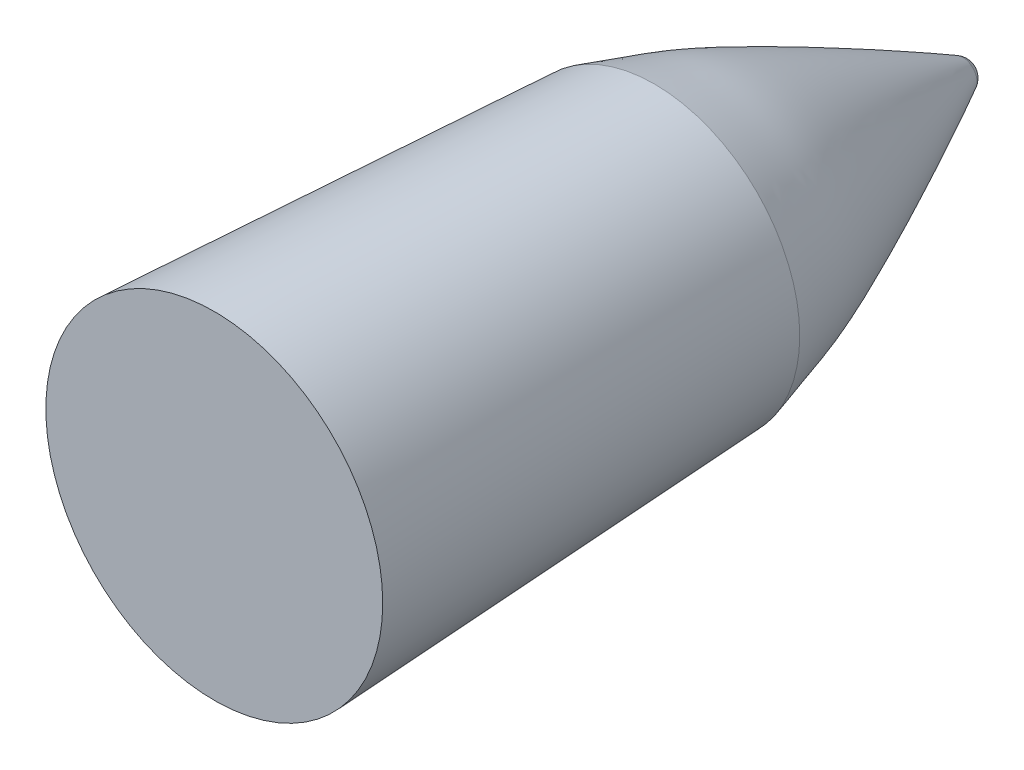
ISO-10303-21;
HEADER;
FILE_DESCRIPTION(('STEP AP214'),'2;1');
FILE_NAME('part.step','',(''),(''),'','','');
FILE_SCHEMA(('AUTOMOTIVE_DESIGN { 1 0 10303 214 1 1 1 1 }'));
ENDSEC;
DATA;
#1=APPLICATION_CONTEXT('core data for automotive mechanical design processes');
#2=APPLICATION_PROTOCOL_DEFINITION('international standard','automotive_design',2000,#1);
#3=PRODUCT_CONTEXT('',#1,'mechanical');
#4=PRODUCT('Part','Part','',(#3));
#5=PRODUCT_RELATED_PRODUCT_CATEGORY('part','',(#4));
#6=PRODUCT_DEFINITION_FORMATION('','',#4);
#7=PRODUCT_DEFINITION_CONTEXT('part definition',#1,'design');
#8=PRODUCT_DEFINITION('design','',#6,#7);
#9=PRODUCT_DEFINITION_SHAPE('','',#8);
#10=(LENGTH_UNIT() NAMED_UNIT(*) SI_UNIT(.MILLI.,.METRE.));
#11=(NAMED_UNIT(*) PLANE_ANGLE_UNIT() SI_UNIT($,.RADIAN.));
#12=(NAMED_UNIT(*) SI_UNIT($,.STERADIAN.) SOLID_ANGLE_UNIT());
#13=UNCERTAINTY_MEASURE_WITH_UNIT(LENGTH_MEASURE(1.E-05),#10,'distance_accuracy_value','');
#14=(GEOMETRIC_REPRESENTATION_CONTEXT(3) GLOBAL_UNCERTAINTY_ASSIGNED_CONTEXT((#13)) GLOBAL_UNIT_ASSIGNED_CONTEXT((#10,
#11,#12)) REPRESENTATION_CONTEXT('',''));
#15=CARTESIAN_POINT('',(0.,0.,0.));
#16=DIRECTION('',(0.,0.,1.));
#17=DIRECTION('',(1.,0.,0.));
#18=AXIS2_PLACEMENT_3D('',#15,#16,#17);
#19=CARTESIAN_POINT('',(1.18232888729888,0.,-78.386897894658));
#20=CARTESIAN_POINT('',(1.1448682870155,0.,-78.337537995573));
#21=CARTESIAN_POINT('',(1.08134637621627,0.,-78.2501250041484));
#22=CARTESIAN_POINT('',(0.887069136221639,0.,-77.9670361500811));
#23=CARTESIAN_POINT('',(0.591669742382043,0.,-77.5048440137872));
#24=CARTESIAN_POINT('',(0.157166302512492,0.,-76.7834785140635));
#25=CARTESIAN_POINT('',(-0.507504384666931,0.,-75.632564394992));
#26=CARTESIAN_POINT('',(-1.47993800360203,0.,-73.8732493620974));
#27=CARTESIAN_POINT('',(-2.81904038998341,0.,-71.3511119580099));
#28=CARTESIAN_POINT('',(-4.28317178062338,0.,-68.5096952638203));
#29=CARTESIAN_POINT('',(-6.34049430938925,0.,-64.4155304953748));
#30=CARTESIAN_POINT('',(-8.99662602090634,0.,-58.9452399370969));
#31=CARTESIAN_POINT('',(-11.9550466861516,0.,-52.5311799018783));
#32=CARTESIAN_POINT('',(-13.9372281625268,0.,-47.8862095161671));
#33=CARTESIAN_POINT('',(-15.0241639350782,0.,-45.0123803284205));
#34=CARTESIAN_POINT('',(-15.6355384490276,0.,-43.1975890317264));
#35=CARTESIAN_POINT('',(-16.1399953178683,0.,-41.546015667143));
#36=CARTESIAN_POINT('',(-16.7941111827417,0.,-39.3247757148786));
#37=CARTESIAN_POINT('',(-17.6838039165856,0.,-36.3876946855298));
#38=CARTESIAN_POINT('',(-18.7810076484271,0.,-32.6183093931523));
#39=CARTESIAN_POINT('',(-19.8618052911475,0.,-28.5429805850924));
#40=CARTESIAN_POINT('',(-20.869841961325,0.,-24.1215405855657));
#41=CARTESIAN_POINT('',(-21.7511525773498,0.,-19.3089534223026));
#42=CARTESIAN_POINT('',(-22.3338291286441,0.,-14.9367043755645));
#43=CARTESIAN_POINT('',(-22.6809313402681,0.,-11.1998995244367));
#44=CARTESIAN_POINT('',(-22.8746511496842,0.,-8.27342327266497));
#45=CARTESIAN_POINT('',(-22.9746433491475,0.,-5.72379418255314));
#46=CARTESIAN_POINT('',(-23.0142011421297,0.,-3.62223137132021));
#47=CARTESIAN_POINT('',(-23.0198829991225,0.,-2.53795958133577));
#48=CARTESIAN_POINT('',(-23.0190686720116,0.,-1.99999999999999));
#49=B_SPLINE_CURVE_WITH_KNOTS('',3,(#19,#20,#21,#22,#23,#24,#25,#26,#27,#28,#29,#30,#31,#32,#33,
#34,#35,#36,#37,#38,#39,#40,#41,#42,#43,#44,#45,#46,#47,#48),.UNSPECIFIED.,.F.,.F.,(4,1,1,1,1,1,
1,1,1,1,1,1,1,1,1,1,1,1,1,1,1,1,1,1,1,1,1,4),(0.0177016813458629,0.0251442890708695,
0.032586896795876,0.047472112245889,0.0623573276959021,0.0772425431459152,0.107012974045941,
0.136783404945967,0.166553835845993,0.196324266746019,0.255865128546072,0.315405990346124,
0.374946852146176,0.404717283046202,0.434487713946228,0.464258144846254,0.49402857574628,
0.553569437546332,0.613110299346384,0.672651161146437,0.732192022946489,0.791732884746541,
0.851273746546593,0.881044177446619,0.910814608346645,0.940585039246671,0.955470254696684,
0.970355470146697),.UNSPECIFIED.);
#50=CARTESIAN_POINT('',(0.,0.,-76.5094565907727));
#51=DIRECTION('',(0.,0.,-1.));
#52=AXIS1_PLACEMENT('',#50,#51);
#53=SURFACE_OF_REVOLUTION('',#49,#52);
#54=CARTESIAN_POINT('',(0.,0.,-34.8639931183328));
#55=DIRECTION('',(0.,0.,-1.));
#56=DIRECTION('',(-1.,0.,0.));
#57=AXIS2_PLACEMENT_3D('',#54,#55,#56);
#58=CIRCLE('',#57,18.124699958068);
#59=CARTESIAN_POINT('',(-18.124699958068,0.,-34.8639931183328));
#60=VERTEX_POINT('',#59);
#61=EDGE_CURVE('E12',#60,#60,#58,.F.);
#62=ORIENTED_EDGE('',*,*,#61,.F.);
#63=EDGE_LOOP('',(#62));
#64=FACE_BOUND('',#63,.T.);
#65=CARTESIAN_POINT('',(9.64539660563083E-09,0.,-73.3340621665054));
#66=DIRECTION('',(0.,0.,-1.));
#67=DIRECTION('',(-1.,0.,0.));
#68=AXIS2_PLACEMENT_3D('',#65,#66,#67);
#69=CIRCLE('',#68,1.76222381539992);
#70=CARTESIAN_POINT('',(-1.76222380575453,0.,-73.3340621665054));
#71=VERTEX_POINT('',#70);
#72=EDGE_CURVE('E64',#71,#71,#69,.T.);
#73=ORIENTED_EDGE('',*,*,#72,.F.);
#74=EDGE_LOOP('',(#73));
#75=FACE_BOUND('',#74,.T.);
#76=ADVANCED_FACE('F51',(#64,#75),#53,.F.);
#77=CARTESIAN_POINT('',(0.,0.,-66.9719738211416));
#78=DIRECTION('',(0.,0.,1.));
#79=DIRECTION('',(1.,0.,0.));
#80=AXIS2_PLACEMENT_3D('',#77,#78,#79);
#81=CONICAL_SURFACE('',#80,16.4419919921711,0.0523598775598305);
#82=ORIENTED_EDGE('',*,*,#61,.T.);
#83=EDGE_LOOP('',(#82));
#84=FACE_BOUND('',#83,.T.);
#85=CARTESIAN_POINT('',(0.,0.,20.));
#86=DIRECTION('',(0.,0.,1.));
#87=DIRECTION('',(1.,0.,0.));
#88=AXIS2_PLACEMENT_3D('',#85,#86,#87);
#89=CIRCLE('',#88,20.9999999999999);
#90=CARTESIAN_POINT('',(20.9999999999999,0.,20.));
#91=VERTEX_POINT('',#90);
#92=EDGE_CURVE('E60',#91,#91,#89,.T.);
#93=ORIENTED_EDGE('',*,*,#92,.F.);
#94=EDGE_LOOP('',(#93));
#95=FACE_BOUND('',#94,.T.);
#96=ADVANCED_FACE('F73',(#84,#95),#81,.T.);
#97=CARTESIAN_POINT('',(-21.,0.,20.));
#98=DIRECTION('',(0.,0.,1.));
#99=DIRECTION('',(1.,0.,0.));
#100=AXIS2_PLACEMENT_3D('',#97,#98,#99);
#101=PLANE('',#100);
#102=ORIENTED_EDGE('',*,*,#92,.T.);
#103=EDGE_LOOP('',(#102));
#104=FACE_BOUND('',#103,.T.);
#105=ADVANCED_FACE('F78',(#104),#101,.T.);
#106=CARTESIAN_POINT('',(9.64539647653048E-09,0.,-72.3882465447045));
#107=DIRECTION('',(0.,0.,-1.));
#108=DIRECTION('',(1.,0.,0.));
#109=AXIS2_PLACEMENT_3D('',#106,#107,#108);
#110=SPHERICAL_SURFACE('',#109,1.99999999150133);
#111=ORIENTED_EDGE('',*,*,#72,.T.);
#112=EDGE_LOOP('',(#111));
#113=FACE_BOUND('',#112,.T.);
#114=ADVANCED_FACE('F70',(#113),#110,.T.);
#115=CLOSED_SHELL('',(#76,#96,#105,#114));
#116=MANIFOLD_SOLID_BREP('B2',#115);
#117=ADVANCED_BREP_SHAPE_REPRESENTATION('',(#18,#116),#14);
#118=SHAPE_DEFINITION_REPRESENTATION(#9,#117);
ENDSEC;
END-ISO-10303-21;
